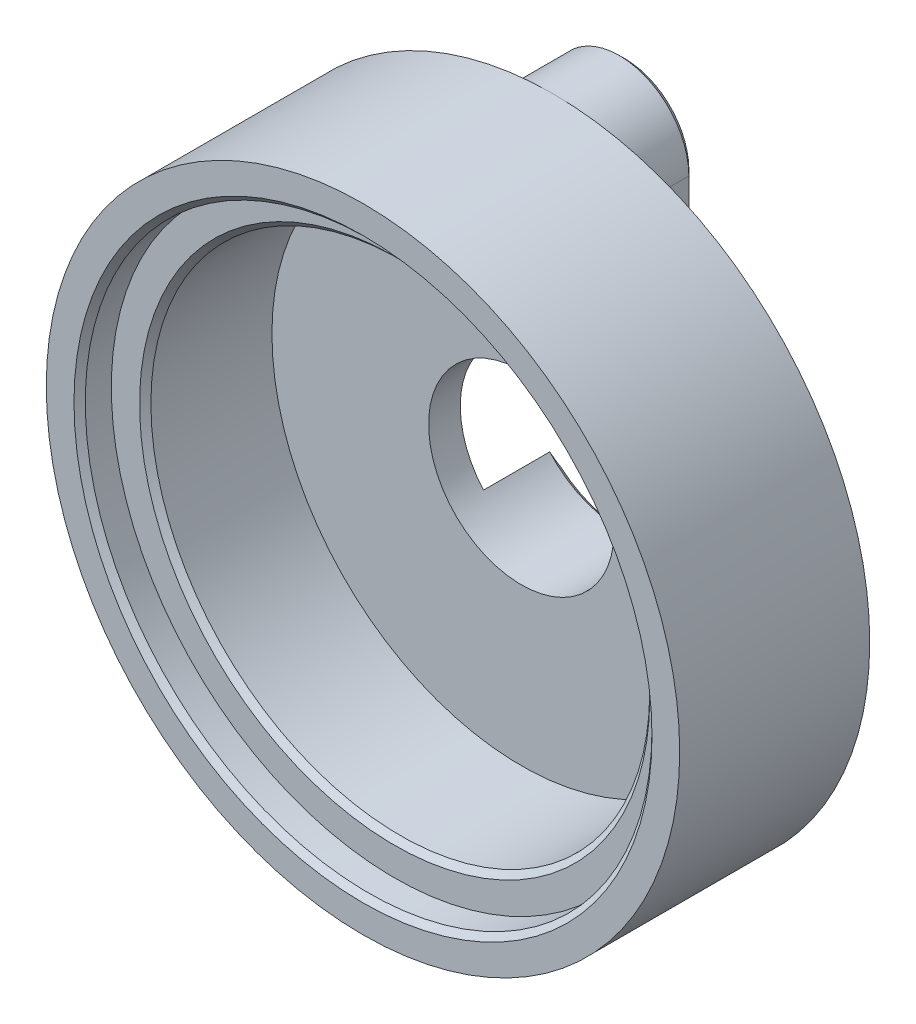
ISO-10303-21;
HEADER;
FILE_DESCRIPTION(('STEP AP214'),'2;1');
FILE_NAME('part.step','',(''),(''),'','','');
FILE_SCHEMA(('AUTOMOTIVE_DESIGN { 1 0 10303 214 1 1 1 1 }'));
ENDSEC;
DATA;
#1=APPLICATION_CONTEXT('core data for automotive mechanical design processes');
#2=APPLICATION_PROTOCOL_DEFINITION('international standard','automotive_design',2000,#1);
#3=PRODUCT_CONTEXT('',#1,'mechanical');
#4=PRODUCT('Part','Part','',(#3));
#5=PRODUCT_RELATED_PRODUCT_CATEGORY('part','',(#4));
#6=PRODUCT_DEFINITION_FORMATION('','',#4);
#7=PRODUCT_DEFINITION_CONTEXT('part definition',#1,'design');
#8=PRODUCT_DEFINITION('design','',#6,#7);
#9=PRODUCT_DEFINITION_SHAPE('','',#8);
#10=(LENGTH_UNIT() NAMED_UNIT(*) SI_UNIT(.MILLI.,.METRE.));
#11=(NAMED_UNIT(*) PLANE_ANGLE_UNIT() SI_UNIT($,.RADIAN.));
#12=(NAMED_UNIT(*) SI_UNIT($,.STERADIAN.) SOLID_ANGLE_UNIT());
#13=UNCERTAINTY_MEASURE_WITH_UNIT(LENGTH_MEASURE(1.E-05),#10,'distance_accuracy_value','');
#14=(GEOMETRIC_REPRESENTATION_CONTEXT(3) GLOBAL_UNCERTAINTY_ASSIGNED_CONTEXT((#13)) GLOBAL_UNIT_ASSIGNED_CONTEXT((#10,
#11,#12)) REPRESENTATION_CONTEXT('',''));
#15=CARTESIAN_POINT('',(0.,0.,0.));
#16=DIRECTION('',(0.,0.,1.));
#17=DIRECTION('',(1.,0.,0.));
#18=AXIS2_PLACEMENT_3D('',#15,#16,#17);
#19=CARTESIAN_POINT('',(0.,0.,4.58));
#20=DIRECTION('',(0.,0.,1.));
#21=DIRECTION('',(1.,0.,0.));
#22=AXIS2_PLACEMENT_3D('',#19,#20,#21);
#23=CYLINDRICAL_SURFACE('',#22,11.025);
#24=CARTESIAN_POINT('',(0.,0.,9.93));
#25=DIRECTION('',(0.,0.,1.));
#26=DIRECTION('',(1.,0.,0.));
#27=AXIS2_PLACEMENT_3D('',#24,#25,#26);
#28=CIRCLE('',#27,11.025);
#29=CARTESIAN_POINT('',(11.025,0.,9.93));
#30=VERTEX_POINT('',#29);
#31=EDGE_CURVE('E11',#30,#30,#28,.T.);
#32=ORIENTED_EDGE('',*,*,#31,.T.);
#33=EDGE_LOOP('',(#32));
#34=FACE_BOUND('',#33,.T.);
#35=CARTESIAN_POINT('',(0.,0.,4.58));
#36=DIRECTION('',(0.,0.,1.));
#37=DIRECTION('',(1.,0.,0.));
#38=AXIS2_PLACEMENT_3D('',#35,#36,#37);
#39=CIRCLE('',#38,11.025);
#40=CARTESIAN_POINT('',(11.025,0.,4.58));
#41=VERTEX_POINT('',#40);
#42=EDGE_CURVE('E214',#41,#41,#39,.T.);
#43=ORIENTED_EDGE('',*,*,#42,.F.);
#44=EDGE_LOOP('',(#43));
#45=FACE_BOUND('',#44,.T.);
#46=ADVANCED_FACE('F41',(#34,#45),#23,.F.);
#47=CARTESIAN_POINT('',(0.,0.,0.));
#48=DIRECTION('',(0.,0.,1.));
#49=DIRECTION('',(1.,0.,0.));
#50=AXIS2_PLACEMENT_3D('',#47,#48,#49);
#51=CYLINDRICAL_SURFACE('',#50,4.1);
#52=DIRECTION('',(0.,0.,1.));
#53=VECTOR('',#52,1.);
#54=CARTESIAN_POINT('',(3.07500000000012,-2.71189509384107,0.));
#55=LINE('',#54,#53);
#56=CARTESIAN_POINT('',(3.07500000000012,-2.71189509384107,0.250000000000004));
#57=VERTEX_POINT('',#56);
#58=CARTESIAN_POINT('',(3.07500000000012,-2.71189509384107,3.18));
#59=VERTEX_POINT('',#58);
#60=EDGE_CURVE('E420',#57,#59,#55,.T.);
#61=ORIENTED_EDGE('',*,*,#60,.F.);
#62=CARTESIAN_POINT('',(0.,0.,0.250000000000004));
#63=DIRECTION('',(0.,0.,1.));
#64=DIRECTION('',(1.,0.,0.));
#65=AXIS2_PLACEMENT_3D('',#62,#63,#64);
#66=CIRCLE('',#65,4.1);
#67=CARTESIAN_POINT('',(-3.07500000000012,-2.71189509384107,0.250000000000004));
#68=VERTEX_POINT('',#67);
#69=EDGE_CURVE('E237',#57,#68,#66,.F.);
#70=ORIENTED_EDGE('',*,*,#69,.T.);
#71=DIRECTION('',(0.,0.,1.));
#72=VECTOR('',#71,1.);
#73=CARTESIAN_POINT('',(-3.07500000000012,-2.71189509384107,0.));
#74=LINE('',#73,#72);
#75=CARTESIAN_POINT('',(-3.07500000000012,-2.71189509384107,3.18));
#76=VERTEX_POINT('',#75);
#77=EDGE_CURVE('E158',#76,#68,#74,.F.);
#78=ORIENTED_EDGE('',*,*,#77,.F.);
#79=CARTESIAN_POINT('',(0.,0.,3.18));
#80=DIRECTION('',(0.,0.,1.));
#81=DIRECTION('',(1.,0.,0.));
#82=AXIS2_PLACEMENT_3D('',#79,#80,#81);
#83=CIRCLE('',#82,4.1);
#84=CARTESIAN_POINT('',(-3.07500000000012,2.71189509384107,3.18));
#85=VERTEX_POINT('',#84);
#86=EDGE_CURVE('E161',#85,#76,#83,.T.);
#87=ORIENTED_EDGE('',*,*,#86,.F.);
#88=DIRECTION('',(0.,0.,1.));
#89=VECTOR('',#88,1.);
#90=CARTESIAN_POINT('',(-3.07500000000012,2.71189509384107,0.));
#91=LINE('',#90,#89);
#92=CARTESIAN_POINT('',(-3.07500000000012,2.71189509384107,0.250000000000004));
#93=VERTEX_POINT('',#92);
#94=EDGE_CURVE('E145',#93,#85,#91,.T.);
#95=ORIENTED_EDGE('',*,*,#94,.F.);
#96=CARTESIAN_POINT('',(0.,0.,0.250000000000004));
#97=DIRECTION('',(0.,0.,1.));
#98=DIRECTION('',(1.,0.,0.));
#99=AXIS2_PLACEMENT_3D('',#96,#97,#98);
#100=CIRCLE('',#99,4.1);
#101=CARTESIAN_POINT('',(3.07500000000012,2.71189509384107,0.250000000000004));
#102=VERTEX_POINT('',#101);
#103=EDGE_CURVE('E234',#93,#102,#100,.F.);
#104=ORIENTED_EDGE('',*,*,#103,.T.);
#105=DIRECTION('',(0.,0.,1.));
#106=VECTOR('',#105,1.);
#107=CARTESIAN_POINT('',(3.07500000000012,2.71189509384107,0.));
#108=LINE('',#107,#106);
#109=CARTESIAN_POINT('',(3.07500000000012,2.71189509384107,3.18));
#110=VERTEX_POINT('',#109);
#111=EDGE_CURVE('E424',#110,#102,#108,.F.);
#112=ORIENTED_EDGE('',*,*,#111,.F.);
#113=CARTESIAN_POINT('',(0.,0.,3.18));
#114=DIRECTION('',(0.,0.,1.));
#115=DIRECTION('',(1.,0.,0.));
#116=AXIS2_PLACEMENT_3D('',#113,#114,#115);
#117=CIRCLE('',#116,4.1);
#118=EDGE_CURVE('E157',#59,#110,#117,.T.);
#119=ORIENTED_EDGE('',*,*,#118,.F.);
#120=EDGE_LOOP('',(#61,#70,#78,#87,#95,#104,#112,#119));
#121=FACE_BOUND('',#120,.T.);
#122=CARTESIAN_POINT('',(0.,0.,4.58));
#123=DIRECTION('',(0.,0.,1.));
#124=DIRECTION('',(1.,0.,0.));
#125=AXIS2_PLACEMENT_3D('',#122,#123,#124);
#126=CIRCLE('',#125,4.1);
#127=CARTESIAN_POINT('',(4.1,0.,4.58));
#128=VERTEX_POINT('',#127);
#129=EDGE_CURVE('E210',#128,#128,#126,.F.);
#130=ORIENTED_EDGE('',*,*,#129,.F.);
#131=EDGE_LOOP('',(#130));
#132=FACE_BOUND('',#131,.T.);
#133=ADVANCED_FACE('F163',(#121,#132),#51,.F.);
#134=CARTESIAN_POINT('',(-3.07500000000012,10.9250000000003,3.18));
#135=DIRECTION('',(1.,0.,0.));
#136=DIRECTION('',(0.,0.,-1.));
#137=AXIS2_PLACEMENT_3D('',#134,#135,#136);
#138=PLANE('',#137);
#139=DIRECTION('',(0.,0.,-1.));
#140=VECTOR('',#139,1.);
#141=CARTESIAN_POINT('',(-3.07500000000012,10.9250000000003,3.18));
#142=LINE('',#141,#140);
#143=CARTESIAN_POINT('',(-3.07500000000012,10.9250000000003,3.18));
#144=VERTEX_POINT('',#143);
#145=CARTESIAN_POINT('',(-3.07500000000012,10.9250000000003,0.250000000000005));
#146=VERTEX_POINT('',#145);
#147=EDGE_CURVE('E170',#144,#146,#142,.T.);
#148=ORIENTED_EDGE('',*,*,#147,.T.);
#149=DIRECTION('',(0.,-1.,0.));
#150=VECTOR('',#149,1.);
#151=CARTESIAN_POINT('',(-3.07500000000012,10.9250000000003,0.250000000000004));
#152=LINE('',#151,#150);
#153=EDGE_CURVE('E153',#146,#93,#152,.T.);
#154=ORIENTED_EDGE('',*,*,#153,.T.);
#155=ORIENTED_EDGE('',*,*,#94,.T.);
#156=DIRECTION('',(0.,-1.,0.));
#157=VECTOR('',#156,1.);
#158=CARTESIAN_POINT('',(-3.07500000000012,10.9250000000003,3.18));
#159=LINE('',#158,#157);
#160=EDGE_CURVE('E150',#144,#85,#159,.T.);
#161=ORIENTED_EDGE('',*,*,#160,.F.);
#162=EDGE_LOOP('',(#148,#154,#155,#161));
#163=FACE_BOUND('',#162,.T.);
#164=ADVANCED_FACE('F148',(#163),#138,.F.);
#165=CARTESIAN_POINT('',(3.07500000000012,10.9250000000003,3.18));
#166=DIRECTION('',(-1.,0.,0.));
#167=DIRECTION('',(0.,0.,1.));
#168=AXIS2_PLACEMENT_3D('',#165,#166,#167);
#169=PLANE('',#168);
#170=DIRECTION('',(0.,0.,-1.));
#171=VECTOR('',#170,1.);
#172=CARTESIAN_POINT('',(3.07500000000012,-10.9250000000003,3.18));
#173=LINE('',#172,#171);
#174=CARTESIAN_POINT('',(3.07500000000012,-10.9250000000003,3.18));
#175=VERTEX_POINT('',#174);
#176=CARTESIAN_POINT('',(3.07500000000012,-10.9250000000003,0.250000000000005));
#177=VERTEX_POINT('',#176);
#178=EDGE_CURVE('E200',#175,#177,#173,.T.);
#179=ORIENTED_EDGE('',*,*,#178,.T.);
#180=DIRECTION('',(0.,1.,0.));
#181=VECTOR('',#180,1.);
#182=CARTESIAN_POINT('',(3.07500000000012,10.9250000000003,0.250000000000004));
#183=LINE('',#182,#181);
#184=EDGE_CURVE('E231',#177,#57,#183,.T.);
#185=ORIENTED_EDGE('',*,*,#184,.T.);
#186=ORIENTED_EDGE('',*,*,#60,.T.);
#187=DIRECTION('',(0.,1.,0.));
#188=VECTOR('',#187,1.);
#189=CARTESIAN_POINT('',(3.07500000000012,10.9250000000003,3.18));
#190=LINE('',#189,#188);
#191=EDGE_CURVE('E192',#175,#59,#190,.T.);
#192=ORIENTED_EDGE('',*,*,#191,.F.);
#193=EDGE_LOOP('',(#179,#185,#186,#192));
#194=FACE_BOUND('',#193,.T.);
#195=ADVANCED_FACE('F367',(#194),#169,.F.);
#196=CARTESIAN_POINT('',(0.,10.9250000000003,0.));
#197=DIRECTION('',(0.,0.,1.));
#198=DIRECTION('',(1.,0.,0.));
#199=AXIS2_PLACEMENT_3D('',#196,#197,#198);
#200=PLANE('',#199);
#201=DIRECTION('',(0.,1.,0.));
#202=VECTOR('',#201,1.);
#203=CARTESIAN_POINT('',(-2.82500000000012,10.9250000000003,0.));
#204=LINE('',#203,#202);
#205=CARTESIAN_POINT('',(-2.82500000000012,3.30785051052785,0.));
#206=VERTEX_POINT('',#205);
#207=CARTESIAN_POINT('',(-2.82500000000012,10.9250000000003,0.));
#208=VERTEX_POINT('',#207);
#209=EDGE_CURVE('E66',#206,#208,#204,.T.);
#210=ORIENTED_EDGE('',*,*,#209,.T.);
#211=CARTESIAN_POINT('',(0.,10.9250000000003,0.));
#212=DIRECTION('',(0.,0.,1.));
#213=DIRECTION('',(1.,0.,0.));
#214=AXIS2_PLACEMENT_3D('',#211,#212,#213);
#215=CIRCLE('',#214,2.82500000000012);
#216=CARTESIAN_POINT('',(2.82500000000012,10.9250000000003,0.));
#217=VERTEX_POINT('',#216);
#218=EDGE_CURVE('E254',#208,#217,#215,.F.);
#219=ORIENTED_EDGE('',*,*,#218,.T.);
#220=DIRECTION('',(0.,-1.,0.));
#221=VECTOR('',#220,1.);
#222=CARTESIAN_POINT('',(2.82500000000012,10.9250000000003,0.));
#223=LINE('',#222,#221);
#224=CARTESIAN_POINT('',(2.82500000000012,3.30785051052785,0.));
#225=VERTEX_POINT('',#224);
#226=EDGE_CURVE('E247',#217,#225,#223,.T.);
#227=ORIENTED_EDGE('',*,*,#226,.T.);
#228=CARTESIAN_POINT('',(0.,0.,0.));
#229=DIRECTION('',(0.,0.,1.));
#230=DIRECTION('',(1.,0.,0.));
#231=AXIS2_PLACEMENT_3D('',#228,#229,#230);
#232=CIRCLE('',#231,4.35);
#233=EDGE_CURVE('E71',#225,#206,#232,.T.);
#234=ORIENTED_EDGE('',*,*,#233,.T.);
#235=EDGE_LOOP('',(#210,#219,#227,#234));
#236=FACE_BOUND('',#235,.T.);
#237=ADVANCED_FACE('F365',(#236),#200,.F.);
#238=CARTESIAN_POINT('',(0.,10.9250000000003,3.18));
#239=DIRECTION('',(0.,0.,-1.));
#240=DIRECTION('',(-1.,0.,0.));
#241=AXIS2_PLACEMENT_3D('',#238,#239,#240);
#242=CYLINDRICAL_SURFACE('',#241,3.07500000000012);
#243=DIRECTION('',(0.,0.,-1.));
#244=VECTOR('',#243,1.);
#245=CARTESIAN_POINT('',(3.07500000000012,10.9250000000003,3.18));
#246=LINE('',#245,#244);
#247=CARTESIAN_POINT('',(3.07500000000012,10.9250000000003,3.18));
#248=VERTEX_POINT('',#247);
#249=CARTESIAN_POINT('',(3.07500000000012,10.9250000000003,0.250000000000005));
#250=VERTEX_POINT('',#249);
#251=EDGE_CURVE('E196',#248,#250,#246,.T.);
#252=ORIENTED_EDGE('',*,*,#251,.T.);
#253=CARTESIAN_POINT('',(0.,10.9250000000003,0.250000000000004));
#254=DIRECTION('',(0.,0.,1.));
#255=DIRECTION('',(1.,0.,0.));
#256=AXIS2_PLACEMENT_3D('',#253,#254,#255);
#257=CIRCLE('',#256,3.07500000000012);
#258=EDGE_CURVE('E243',#250,#146,#257,.T.);
#259=ORIENTED_EDGE('',*,*,#258,.T.);
#260=ORIENTED_EDGE('',*,*,#147,.F.);
#261=CARTESIAN_POINT('',(0.,10.9250000000003,3.18));
#262=DIRECTION('',(0.,0.,1.));
#263=DIRECTION('',(1.,0.,0.));
#264=AXIS2_PLACEMENT_3D('',#261,#262,#263);
#265=CIRCLE('',#264,3.07500000000012);
#266=CARTESIAN_POINT('',(0.,14.0000000000004,3.18));
#267=VERTEX_POINT('',#266);
#268=EDGE_CURVE('E175',#267,#144,#265,.T.);
#269=ORIENTED_EDGE('',*,*,#268,.F.);
#270=EDGE_CURVE('E185',#248,#267,#265,.T.);
#271=ORIENTED_EDGE('',*,*,#270,.F.);
#272=EDGE_LOOP('',(#252,#259,#260,#269,#271));
#273=FACE_BOUND('',#272,.T.);
#274=ADVANCED_FACE('F353',(#273),#242,.T.);
#275=ORIENTED_EDGE('',*,*,#77,.T.);
#276=DIRECTION('',(0.,-1.,0.));
#277=VECTOR('',#276,1.);
#278=CARTESIAN_POINT('',(-3.07500000000012,10.9250000000003,0.250000000000004));
#279=LINE('',#278,#277);
#280=CARTESIAN_POINT('',(-3.07500000000012,-10.9250000000003,0.250000000000005));
#281=VERTEX_POINT('',#280);
#282=EDGE_CURVE('E240',#68,#281,#279,.T.);
#283=ORIENTED_EDGE('',*,*,#282,.T.);
#284=DIRECTION('',(0.,0.,-1.));
#285=VECTOR('',#284,1.);
#286=CARTESIAN_POINT('',(-3.07500000000012,-10.9250000000003,3.18));
#287=LINE('',#286,#285);
#288=CARTESIAN_POINT('',(-3.07500000000012,-10.9250000000003,3.18));
#289=VERTEX_POINT('',#288);
#290=EDGE_CURVE('E204',#289,#281,#287,.T.);
#291=ORIENTED_EDGE('',*,*,#290,.F.);
#292=EDGE_CURVE('E178',#76,#289,#159,.T.);
#293=ORIENTED_EDGE('',*,*,#292,.F.);
#294=EDGE_LOOP('',(#275,#283,#291,#293));
#295=FACE_BOUND('',#294,.T.);
#296=ADVANCED_FACE('F374',(#295),#138,.F.);
#297=CARTESIAN_POINT('',(0.,-10.9250000000003,3.18));
#298=DIRECTION('',(0.,0.,-1.));
#299=DIRECTION('',(-1.,0.,0.));
#300=AXIS2_PLACEMENT_3D('',#297,#298,#299);
#301=CYLINDRICAL_SURFACE('',#300,3.07500000000012);
#302=ORIENTED_EDGE('',*,*,#290,.T.);
#303=CARTESIAN_POINT('',(0.,-10.9250000000003,0.250000000000004));
#304=DIRECTION('',(0.,0.,1.));
#305=DIRECTION('',(1.,0.,0.));
#306=AXIS2_PLACEMENT_3D('',#303,#304,#305);
#307=CIRCLE('',#306,3.07500000000012);
#308=EDGE_CURVE('E169',#281,#177,#307,.T.);
#309=ORIENTED_EDGE('',*,*,#308,.T.);
#310=ORIENTED_EDGE('',*,*,#178,.F.);
#311=CARTESIAN_POINT('',(0.,-10.9250000000003,3.18));
#312=DIRECTION('',(0.,0.,1.));
#313=DIRECTION('',(-1.,0.,0.));
#314=AXIS2_PLACEMENT_3D('',#311,#312,#313);
#315=CIRCLE('',#314,3.07500000000012);
#316=CARTESIAN_POINT('',(0.,-14.0000000000004,3.18));
#317=VERTEX_POINT('',#316);
#318=EDGE_CURVE('E177',#317,#175,#315,.T.);
#319=ORIENTED_EDGE('',*,*,#318,.F.);
#320=EDGE_CURVE('E183',#289,#317,#315,.T.);
#321=ORIENTED_EDGE('',*,*,#320,.F.);
#322=EDGE_LOOP('',(#302,#309,#310,#319,#321));
#323=FACE_BOUND('',#322,.T.);
#324=ADVANCED_FACE('F458',(#323),#301,.T.);
#325=ORIENTED_EDGE('',*,*,#111,.T.);
#326=DIRECTION('',(0.,1.,0.));
#327=VECTOR('',#326,1.);
#328=CARTESIAN_POINT('',(3.07500000000012,10.9250000000003,0.250000000000004));
#329=LINE('',#328,#327);
#330=EDGE_CURVE('E259',#102,#250,#329,.T.);
#331=ORIENTED_EDGE('',*,*,#330,.T.);
#332=ORIENTED_EDGE('',*,*,#251,.F.);
#333=EDGE_CURVE('E191',#110,#248,#190,.T.);
#334=ORIENTED_EDGE('',*,*,#333,.F.);
#335=EDGE_LOOP('',(#325,#331,#332,#334));
#336=FACE_BOUND('',#335,.T.);
#337=ADVANCED_FACE('F378',(#336),#169,.F.);
#338=DIRECTION('',(0.,-1.,0.));
#339=VECTOR('',#338,1.);
#340=CARTESIAN_POINT('',(2.82500000000012,10.9250000000003,0.));
#341=LINE('',#340,#339);
#342=CARTESIAN_POINT('',(2.82500000000012,-3.30785051052785,0.));
#343=VERTEX_POINT('',#342);
#344=CARTESIAN_POINT('',(2.82500000000012,-10.9250000000003,0.));
#345=VERTEX_POINT('',#344);
#346=EDGE_CURVE('E224',#343,#345,#341,.T.);
#347=ORIENTED_EDGE('',*,*,#346,.T.);
#348=CARTESIAN_POINT('',(0.,-10.9250000000003,0.));
#349=DIRECTION('',(0.,0.,1.));
#350=DIRECTION('',(1.,0.,0.));
#351=AXIS2_PLACEMENT_3D('',#348,#349,#350);
#352=CIRCLE('',#351,2.82500000000012);
#353=CARTESIAN_POINT('',(-2.82500000000012,-10.9250000000003,0.));
#354=VERTEX_POINT('',#353);
#355=EDGE_CURVE('E227',#345,#354,#352,.F.);
#356=ORIENTED_EDGE('',*,*,#355,.T.);
#357=DIRECTION('',(0.,1.,0.));
#358=VECTOR('',#357,1.);
#359=CARTESIAN_POINT('',(-2.82500000000012,10.9250000000003,0.));
#360=LINE('',#359,#358);
#361=CARTESIAN_POINT('',(-2.82500000000012,-3.30785051052785,0.));
#362=VERTEX_POINT('',#361);
#363=EDGE_CURVE('E218',#354,#362,#360,.T.);
#364=ORIENTED_EDGE('',*,*,#363,.T.);
#365=CARTESIAN_POINT('',(0.,0.,0.));
#366=DIRECTION('',(0.,0.,1.));
#367=DIRECTION('',(1.,0.,0.));
#368=AXIS2_PLACEMENT_3D('',#365,#366,#367);
#369=CIRCLE('',#368,4.35);
#370=EDGE_CURVE('E221',#362,#343,#369,.T.);
#371=ORIENTED_EDGE('',*,*,#370,.T.);
#372=EDGE_LOOP('',(#347,#356,#364,#371));
#373=FACE_BOUND('',#372,.T.);
#374=ADVANCED_FACE('F369',(#373),#200,.F.);
#375=CARTESIAN_POINT('',(0.,0.,3.18));
#376=DIRECTION('',(0.,0.,1.));
#377=DIRECTION('',(1.,0.,0.));
#378=AXIS2_PLACEMENT_3D('',#375,#376,#377);
#379=PLANE('',#378);
#380=ORIENTED_EDGE('',*,*,#191,.T.);
#381=ORIENTED_EDGE('',*,*,#118,.T.);
#382=ORIENTED_EDGE('',*,*,#333,.T.);
#383=ORIENTED_EDGE('',*,*,#270,.T.);
#384=CARTESIAN_POINT('',(0.,0.,3.18));
#385=DIRECTION('',(0.,0.,1.));
#386=DIRECTION('',(1.,0.,0.));
#387=AXIS2_PLACEMENT_3D('',#384,#385,#386);
#388=CIRCLE('',#387,14.);
#389=EDGE_CURVE('E415',#317,#267,#388,.T.);
#390=ORIENTED_EDGE('',*,*,#389,.F.);
#391=ORIENTED_EDGE('',*,*,#318,.T.);
#392=EDGE_LOOP('',(#380,#381,#382,#383,#390,#391));
#393=FACE_BOUND('',#392,.T.);
#394=ADVANCED_FACE('F381',(#393),#379,.F.);
#395=CARTESIAN_POINT('',(0.,0.,11.58));
#396=DIRECTION('',(0.,0.,-1.));
#397=DIRECTION('',(-1.,0.,0.));
#398=AXIS2_PLACEMENT_3D('',#395,#396,#397);
#399=CYLINDRICAL_SURFACE('',#398,14.);
#400=CARTESIAN_POINT('',(0.,0.,11.58));
#401=DIRECTION('',(0.,0.,1.));
#402=DIRECTION('',(1.,0.,0.));
#403=AXIS2_PLACEMENT_3D('',#400,#401,#402);
#404=CIRCLE('',#403,14.);
#405=CARTESIAN_POINT('',(14.,0.,11.58));
#406=VERTEX_POINT('',#405);
#407=EDGE_CURVE('E410',#406,#406,#404,.T.);
#408=ORIENTED_EDGE('',*,*,#407,.F.);
#409=EDGE_LOOP('',(#408));
#410=FACE_BOUND('',#409,.T.);
#411=EDGE_CURVE('E413',#267,#317,#388,.T.);
#412=ORIENTED_EDGE('',*,*,#411,.T.);
#413=ORIENTED_EDGE('',*,*,#389,.T.);
#414=EDGE_LOOP('',(#412,#413));
#415=FACE_BOUND('',#414,.T.);
#416=ADVANCED_FACE('F398',(#410,#415),#399,.T.);
#417=CARTESIAN_POINT('',(0.,0.,11.58));
#418=DIRECTION('',(0.,0.,1.));
#419=DIRECTION('',(1.,0.,0.));
#420=AXIS2_PLACEMENT_3D('',#417,#418,#419);
#421=PLANE('',#420);
#422=CARTESIAN_POINT('',(0.,0.,11.58));
#423=DIRECTION('',(0.,0.,1.));
#424=DIRECTION('',(1.,0.,0.));
#425=AXIS2_PLACEMENT_3D('',#422,#423,#424);
#426=CIRCLE('',#425,12.775);
#427=CARTESIAN_POINT('',(12.775,0.,11.58));
#428=VERTEX_POINT('',#427);
#429=EDGE_CURVE('E266',#428,#428,#426,.F.);
#430=ORIENTED_EDGE('',*,*,#429,.T.);
#431=EDGE_LOOP('',(#430));
#432=FACE_BOUND('',#431,.T.);
#433=ORIENTED_EDGE('',*,*,#407,.T.);
#434=EDGE_LOOP('',(#433));
#435=FACE_BOUND('',#434,.T.);
#436=ADVANCED_FACE('F395',(#432,#435),#421,.T.);
#437=ORIENTED_EDGE('',*,*,#160,.T.);
#438=ORIENTED_EDGE('',*,*,#86,.T.);
#439=ORIENTED_EDGE('',*,*,#292,.T.);
#440=ORIENTED_EDGE('',*,*,#320,.T.);
#441=ORIENTED_EDGE('',*,*,#411,.F.);
#442=ORIENTED_EDGE('',*,*,#268,.T.);
#443=EDGE_LOOP('',(#437,#438,#439,#440,#441,#442));
#444=FACE_BOUND('',#443,.T.);
#445=ADVANCED_FACE('F173',(#444),#379,.F.);
#446=CARTESIAN_POINT('',(0.,0.,4.58));
#447=DIRECTION('',(0.,0.,1.));
#448=DIRECTION('',(1.,0.,0.));
#449=AXIS2_PLACEMENT_3D('',#446,#447,#448);
#450=PLANE('',#449);
#451=ORIENTED_EDGE('',*,*,#42,.T.);
#452=EDGE_LOOP('',(#451));
#453=FACE_BOUND('',#452,.T.);
#454=ORIENTED_EDGE('',*,*,#129,.T.);
#455=EDGE_LOOP('',(#454));
#456=FACE_BOUND('',#455,.T.);
#457=ADVANCED_FACE('F392',(#453,#456),#450,.T.);
#458=CARTESIAN_POINT('',(0.,0.,10.18));
#459=DIRECTION('',(0.,0.,1.));
#460=DIRECTION('',(1.,0.,0.));
#461=AXIS2_PLACEMENT_3D('',#458,#459,#460);
#462=PLANE('',#461);
#463=CARTESIAN_POINT('',(0.,0.,10.18));
#464=DIRECTION('',(0.,0.,1.));
#465=DIRECTION('',(1.,0.,0.));
#466=AXIS2_PLACEMENT_3D('',#463,#464,#465);
#467=CIRCLE('',#466,11.275);
#468=CARTESIAN_POINT('',(11.275,0.,10.18));
#469=VERTEX_POINT('',#468);
#470=EDGE_CURVE('E58',#469,#469,#467,.F.);
#471=ORIENTED_EDGE('',*,*,#470,.T.);
#472=EDGE_LOOP('',(#471));
#473=FACE_BOUND('',#472,.T.);
#474=CARTESIAN_POINT('',(0.,0.,10.18));
#475=DIRECTION('',(0.,0.,1.));
#476=DIRECTION('',(1.,0.,0.));
#477=AXIS2_PLACEMENT_3D('',#474,#475,#476);
#478=CIRCLE('',#477,12.525);
#479=CARTESIAN_POINT('',(12.525,0.,10.18));
#480=VERTEX_POINT('',#479);
#481=EDGE_CURVE('E436',#480,#480,#478,.T.);
#482=ORIENTED_EDGE('',*,*,#481,.T.);
#483=EDGE_LOOP('',(#482));
#484=FACE_BOUND('',#483,.T.);
#485=ADVANCED_FACE('F526',(#473,#484),#462,.T.);
#486=CARTESIAN_POINT('',(0.,0.,10.18));
#487=DIRECTION('',(0.,0.,1.));
#488=DIRECTION('',(1.,0.,0.));
#489=AXIS2_PLACEMENT_3D('',#486,#487,#488);
#490=CYLINDRICAL_SURFACE('',#489,12.525);
#491=CARTESIAN_POINT('',(0.,0.,11.33));
#492=DIRECTION('',(0.,0.,1.));
#493=DIRECTION('',(1.,0.,0.));
#494=AXIS2_PLACEMENT_3D('',#491,#492,#493);
#495=CIRCLE('',#494,12.525);
#496=CARTESIAN_POINT('',(12.525,0.,11.33));
#497=VERTEX_POINT('',#496);
#498=EDGE_CURVE('E262',#497,#497,#495,.T.);
#499=ORIENTED_EDGE('',*,*,#498,.T.);
#500=EDGE_LOOP('',(#499));
#501=FACE_BOUND('',#500,.T.);
#502=ORIENTED_EDGE('',*,*,#481,.F.);
#503=EDGE_LOOP('',(#502));
#504=FACE_BOUND('',#503,.T.);
#505=ADVANCED_FACE('F531',(#501,#504),#490,.F.);
#506=CARTESIAN_POINT('',(0.,0.,0.));
#507=DIRECTION('',(0.,0.,-1.));
#508=DIRECTION('',(-1.,0.,0.));
#509=AXIS2_PLACEMENT_3D('',#506,#507,#508);
#510=CONICAL_SURFACE('',#509,4.35,0.785398163397448);
#511=CARTESIAN_POINT('',(3.07500000000012,-2.71189509384107,0.250000000000004));
#512=CARTESIAN_POINT('',(3.05574046867824,-2.76285083500798,0.230740468678121));
#513=CARTESIAN_POINT('',(3.03605925491271,-2.81348646573774,0.211059254912599));
#514=CARTESIAN_POINT('',(2.99590345016405,-2.91409333420815,0.170903450163933));
#515=CARTESIAN_POINT('',(2.97542923755139,-2.9640648738907,0.150429237551274));
#516=CARTESIAN_POINT('',(2.93371996144002,-3.06336558932871,0.108719961439907));
#517=CARTESIAN_POINT('',(2.91248492617271,-3.11269478882669,0.0874849261725893));
#518=CARTESIAN_POINT('',(2.86928116641403,-3.21073886251874,0.0442811664139128));
#519=CARTESIAN_POINT('',(2.84731210064038,-3.25945343602839,0.0223121006402624));
#520=CARTESIAN_POINT('',(2.82500000000012,-3.30785051052786,0.));
#521=B_SPLINE_CURVE_WITH_KNOTS('',3,(#511,#512,#513,#514,#515,#516,#517,#518,#519,#520),
.UNSPECIFIED.,.F.,.F.,(4,2,2,2,4),(0.,0.17332961082576,0.346577514298405,0.519818995809545,
0.693142177339452),.UNSPECIFIED.);
#522=EDGE_CURVE('E279',#343,#57,#521,.F.);
#523=ORIENTED_EDGE('',*,*,#522,.F.);
#524=ORIENTED_EDGE('',*,*,#370,.F.);
#525=CARTESIAN_POINT('',(-3.07500000000012,-2.71189509384107,0.250000000000004));
#526=CARTESIAN_POINT('',(-3.05574046867824,-2.76285083500798,0.230740468678121));
#527=CARTESIAN_POINT('',(-3.03605925491271,-2.81348646573774,0.211059254912599));
#528=CARTESIAN_POINT('',(-2.99590345016405,-2.91409333420815,0.170903450163933));
#529=CARTESIAN_POINT('',(-2.97542923755139,-2.9640648738907,0.150429237551274));
#530=CARTESIAN_POINT('',(-2.93371996144002,-3.06336558932871,0.108719961439907));
#531=CARTESIAN_POINT('',(-2.91248492617271,-3.11269478882669,0.0874849261725893));
#532=CARTESIAN_POINT('',(-2.86928116641403,-3.21073886251874,0.0442811664139128));
#533=CARTESIAN_POINT('',(-2.84731210064038,-3.25945343602839,0.0223121006402624));
#534=CARTESIAN_POINT('',(-2.82500000000012,-3.30785051052786,0.));
#535=B_SPLINE_CURVE_WITH_KNOTS('',3,(#525,#526,#527,#528,#529,#530,#531,#532,#533,#534),
.UNSPECIFIED.,.F.,.F.,(4,2,2,2,4),(0.,0.17332961082576,0.346577514298405,0.519818995809545,
0.693142177339452),.UNSPECIFIED.);
#536=EDGE_CURVE('E289',#68,#362,#535,.T.);
#537=ORIENTED_EDGE('',*,*,#536,.F.);
#538=ORIENTED_EDGE('',*,*,#69,.F.);
#539=EDGE_LOOP('',(#523,#524,#537,#538));
#540=FACE_BOUND('',#539,.T.);
#541=ADVANCED_FACE('F297',(#540),#510,.F.);
#542=CARTESIAN_POINT('',(-3.07500000000012,10.9250000000003,0.250000000000004));
#543=DIRECTION('',(0.707106781186547,0.,0.707106781186547));
#544=DIRECTION('',(0.,-1.,0.));
#545=AXIS2_PLACEMENT_3D('',#542,#543,#544);
#546=PLANE('',#545);
#547=ORIENTED_EDGE('',*,*,#536,.T.);
#548=ORIENTED_EDGE('',*,*,#363,.F.);
#549=DIRECTION('',(0.707106781186547,0.,-0.707106781186547));
#550=VECTOR('',#549,1.);
#551=CARTESIAN_POINT('',(-3.07500000000012,-10.9250000000003,0.250000000000004));
#552=LINE('',#551,#550);
#553=EDGE_CURVE('E276',#281,#354,#552,.T.);
#554=ORIENTED_EDGE('',*,*,#553,.F.);
#555=ORIENTED_EDGE('',*,*,#282,.F.);
#556=EDGE_LOOP('',(#547,#548,#554,#555));
#557=FACE_BOUND('',#556,.T.);
#558=ADVANCED_FACE('F308',(#557),#546,.F.);
#559=CARTESIAN_POINT('',(3.07500000000012,10.9250000000003,0.250000000000004));
#560=DIRECTION('',(-0.707106781186547,0.,0.707106781186547));
#561=DIRECTION('',(0.,1.,0.));
#562=AXIS2_PLACEMENT_3D('',#559,#560,#561);
#563=PLANE('',#562);
#564=ORIENTED_EDGE('',*,*,#522,.T.);
#565=ORIENTED_EDGE('',*,*,#184,.F.);
#566=DIRECTION('',(0.707106781186547,0.,0.707106781186547));
#567=VECTOR('',#566,1.);
#568=CARTESIAN_POINT('',(2.82500000000012,-10.9250000000003,0.));
#569=LINE('',#568,#567);
#570=EDGE_CURVE('E273',#345,#177,#569,.T.);
#571=ORIENTED_EDGE('',*,*,#570,.F.);
#572=ORIENTED_EDGE('',*,*,#346,.F.);
#573=EDGE_LOOP('',(#564,#565,#571,#572));
#574=FACE_BOUND('',#573,.T.);
#575=ADVANCED_FACE('F301',(#574),#563,.F.);
#576=CARTESIAN_POINT('',(0.,-10.9250000000003,0.250000000000004));
#577=DIRECTION('',(0.,0.,1.));
#578=DIRECTION('',(1.,0.,0.));
#579=AXIS2_PLACEMENT_3D('',#576,#577,#578);
#580=CONICAL_SURFACE('',#579,3.07500000000012,0.785398163397448);
#581=ORIENTED_EDGE('',*,*,#553,.T.);
#582=ORIENTED_EDGE('',*,*,#355,.F.);
#583=ORIENTED_EDGE('',*,*,#570,.T.);
#584=ORIENTED_EDGE('',*,*,#308,.F.);
#585=EDGE_LOOP('',(#581,#582,#583,#584));
#586=FACE_BOUND('',#585,.T.);
#587=ADVANCED_FACE('F307',(#586),#580,.T.);
#588=CARTESIAN_POINT('',(0.,0.,0.));
#589=DIRECTION('',(0.,0.,-1.));
#590=DIRECTION('',(-1.,0.,0.));
#591=AXIS2_PLACEMENT_3D('',#588,#589,#590);
#592=CONICAL_SURFACE('',#591,4.35,0.785398163397448);
#593=CARTESIAN_POINT('',(-3.07500000000012,2.71189509384107,0.250000000000004));
#594=CARTESIAN_POINT('',(-3.05574046867824,2.76285083500798,0.230740468678121));
#595=CARTESIAN_POINT('',(-3.03605925491271,2.81348646573774,0.211059254912599));
#596=CARTESIAN_POINT('',(-2.99590345016405,2.91409333420815,0.170903450163933));
#597=CARTESIAN_POINT('',(-2.97542923755139,2.9640648738907,0.150429237551274));
#598=CARTESIAN_POINT('',(-2.93371996144002,3.06336558932871,0.108719961439907));
#599=CARTESIAN_POINT('',(-2.91248492617271,3.11269478882669,0.0874849261725893));
#600=CARTESIAN_POINT('',(-2.86928116641403,3.21073886251874,0.0442811664139128));
#601=CARTESIAN_POINT('',(-2.84731210064038,3.25945343602839,0.0223121006402624));
#602=CARTESIAN_POINT('',(-2.82500000000012,3.30785051052786,0.));
#603=B_SPLINE_CURVE_WITH_KNOTS('',3,(#593,#594,#595,#596,#597,#598,#599,#600,#601,#602),
.UNSPECIFIED.,.F.,.F.,(4,2,2,2,4),(0.,0.17332961082576,0.346577514298405,0.519818995809545,
0.693142177339452),.UNSPECIFIED.);
#604=EDGE_CURVE('E337',#206,#93,#603,.F.);
#605=ORIENTED_EDGE('',*,*,#604,.F.);
#606=ORIENTED_EDGE('',*,*,#233,.F.);
#607=CARTESIAN_POINT('',(3.07500000000012,2.71189509384107,0.250000000000004));
#608=CARTESIAN_POINT('',(3.05574046867824,2.76285083500798,0.230740468678121));
#609=CARTESIAN_POINT('',(3.03605925491271,2.81348646573774,0.211059254912599));
#610=CARTESIAN_POINT('',(2.99590345016405,2.91409333420815,0.170903450163933));
#611=CARTESIAN_POINT('',(2.97542923755139,2.9640648738907,0.150429237551274));
#612=CARTESIAN_POINT('',(2.93371996144002,3.06336558932871,0.108719961439907));
#613=CARTESIAN_POINT('',(2.91248492617271,3.11269478882669,0.0874849261725893));
#614=CARTESIAN_POINT('',(2.86928116641403,3.21073886251874,0.0442811664139128));
#615=CARTESIAN_POINT('',(2.84731210064038,3.25945343602839,0.0223121006402624));
#616=CARTESIAN_POINT('',(2.82500000000012,3.30785051052786,0.));
#617=B_SPLINE_CURVE_WITH_KNOTS('',3,(#607,#608,#609,#610,#611,#612,#613,#614,#615,#616),
.UNSPECIFIED.,.F.,.F.,(4,2,2,2,4),(0.,0.17332961082576,0.346577514298405,0.519818995809545,
0.693142177339452),.UNSPECIFIED.);
#618=EDGE_CURVE('E46',#102,#225,#617,.T.);
#619=ORIENTED_EDGE('',*,*,#618,.F.);
#620=ORIENTED_EDGE('',*,*,#103,.F.);
#621=EDGE_LOOP('',(#605,#606,#619,#620));
#622=FACE_BOUND('',#621,.T.);
#623=ADVANCED_FACE('F326',(#622),#592,.F.);
#624=CARTESIAN_POINT('',(3.07500000000012,10.9250000000003,0.250000000000004));
#625=DIRECTION('',(-0.707106781186547,0.,0.707106781186547));
#626=DIRECTION('',(0.,1.,0.));
#627=AXIS2_PLACEMENT_3D('',#624,#625,#626);
#628=PLANE('',#627);
#629=ORIENTED_EDGE('',*,*,#618,.T.);
#630=ORIENTED_EDGE('',*,*,#226,.F.);
#631=DIRECTION('',(-0.707106781186547,0.,-0.707106781186547));
#632=VECTOR('',#631,1.);
#633=CARTESIAN_POINT('',(3.07500000000012,10.9250000000003,0.250000000000004));
#634=LINE('',#633,#632);
#635=EDGE_CURVE('E345',#250,#217,#634,.T.);
#636=ORIENTED_EDGE('',*,*,#635,.F.);
#637=ORIENTED_EDGE('',*,*,#330,.F.);
#638=EDGE_LOOP('',(#629,#630,#636,#637));
#639=FACE_BOUND('',#638,.T.);
#640=ADVANCED_FACE('F333',(#639),#628,.F.);
#641=CARTESIAN_POINT('',(-3.07500000000012,10.9250000000003,0.250000000000004));
#642=DIRECTION('',(0.707106781186547,0.,0.707106781186547));
#643=DIRECTION('',(0.,-1.,0.));
#644=AXIS2_PLACEMENT_3D('',#641,#642,#643);
#645=PLANE('',#644);
#646=ORIENTED_EDGE('',*,*,#604,.T.);
#647=ORIENTED_EDGE('',*,*,#153,.F.);
#648=DIRECTION('',(-0.707106781186547,0.,0.707106781186547));
#649=VECTOR('',#648,1.);
#650=CARTESIAN_POINT('',(-2.82500000000012,10.9250000000003,0.));
#651=LINE('',#650,#649);
#652=EDGE_CURVE('E347',#208,#146,#651,.T.);
#653=ORIENTED_EDGE('',*,*,#652,.F.);
#654=ORIENTED_EDGE('',*,*,#209,.F.);
#655=EDGE_LOOP('',(#646,#647,#653,#654));
#656=FACE_BOUND('',#655,.T.);
#657=ADVANCED_FACE('F324',(#656),#645,.F.);
#658=CARTESIAN_POINT('',(0.,10.9250000000003,0.250000000000004));
#659=DIRECTION('',(0.,0.,1.));
#660=DIRECTION('',(1.,0.,0.));
#661=AXIS2_PLACEMENT_3D('',#658,#659,#660);
#662=CONICAL_SURFACE('',#661,3.07500000000012,0.785398163397448);
#663=ORIENTED_EDGE('',*,*,#635,.T.);
#664=ORIENTED_EDGE('',*,*,#218,.F.);
#665=ORIENTED_EDGE('',*,*,#652,.T.);
#666=ORIENTED_EDGE('',*,*,#258,.F.);
#667=EDGE_LOOP('',(#663,#664,#665,#666));
#668=FACE_BOUND('',#667,.T.);
#669=ADVANCED_FACE('F317',(#668),#662,.T.);
#670=CARTESIAN_POINT('',(0.,0.,11.33));
#671=DIRECTION('',(0.,0.,1.));
#672=DIRECTION('',(1.,0.,0.));
#673=AXIS2_PLACEMENT_3D('',#670,#671,#672);
#674=CONICAL_SURFACE('',#673,12.525,0.785398163397448);
#675=ORIENTED_EDGE('',*,*,#429,.F.);
#676=EDGE_LOOP('',(#675));
#677=FACE_BOUND('',#676,.T.);
#678=ORIENTED_EDGE('',*,*,#498,.F.);
#679=EDGE_LOOP('',(#678));
#680=FACE_BOUND('',#679,.T.);
#681=ADVANCED_FACE('F323',(#677,#680),#674,.F.);
#682=CARTESIAN_POINT('',(0.,0.,10.18));
#683=DIRECTION('',(0.,0.,1.));
#684=DIRECTION('',(1.,0.,0.));
#685=AXIS2_PLACEMENT_3D('',#682,#683,#684);
#686=CONICAL_SURFACE('',#685,11.275,0.785398163397441);
#687=ORIENTED_EDGE('',*,*,#31,.F.);
#688=EDGE_LOOP('',(#687));
#689=FACE_BOUND('',#688,.T.);
#690=ORIENTED_EDGE('',*,*,#470,.F.);
#691=EDGE_LOOP('',(#690));
#692=FACE_BOUND('',#691,.T.);
#693=ADVANCED_FACE('F44',(#689,#692),#686,.F.);
#694=CLOSED_SHELL('',(#46,#133,#164,#195,#237,#274,#296,#324,#337,#374,#394,#416,#436,#445,#457,
#485,#505,#541,#558,#575,#587,#623,#640,#657,#669,#681,#693));
#695=MANIFOLD_SOLID_BREP('B2',#694);
#696=ADVANCED_BREP_SHAPE_REPRESENTATION('',(#18,#695),#14);
#697=SHAPE_DEFINITION_REPRESENTATION(#9,#696);
ENDSEC;
END-ISO-10303-21;
